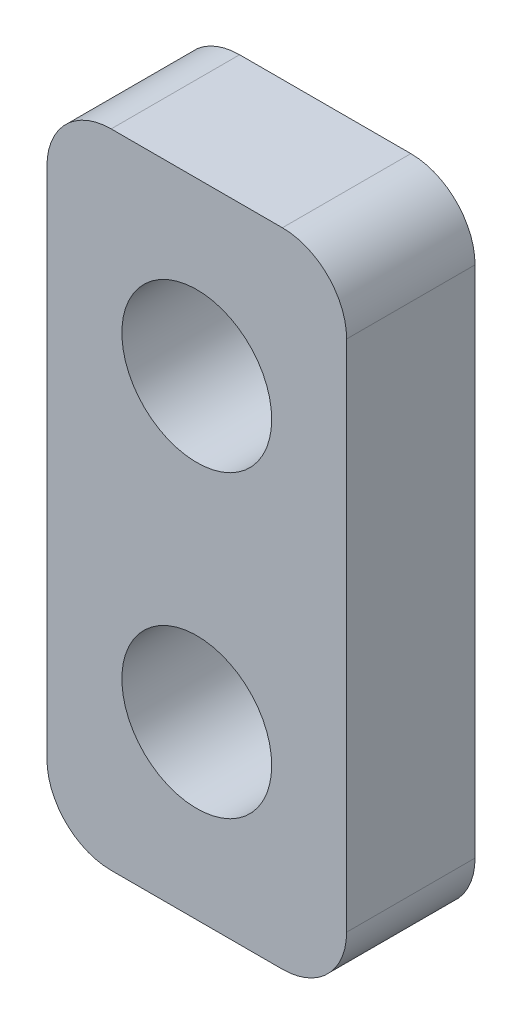
ISO-10303-21;
HEADER;
FILE_DESCRIPTION(('STEP AP214'),'2;1');
FILE_NAME('part.step','',(''),(''),'','','');
FILE_SCHEMA(('AUTOMOTIVE_DESIGN { 1 0 10303 214 1 1 1 1 }'));
ENDSEC;
DATA;
#1=APPLICATION_CONTEXT('core data for automotive mechanical design processes');
#2=APPLICATION_PROTOCOL_DEFINITION('international standard','automotive_design',2000,#1);
#3=PRODUCT_CONTEXT('',#1,'mechanical');
#4=PRODUCT('Part','Part','',(#3));
#5=PRODUCT_RELATED_PRODUCT_CATEGORY('part','',(#4));
#6=PRODUCT_DEFINITION_FORMATION('','',#4);
#7=PRODUCT_DEFINITION_CONTEXT('part definition',#1,'design');
#8=PRODUCT_DEFINITION('design','',#6,#7);
#9=PRODUCT_DEFINITION_SHAPE('','',#8);
#10=(LENGTH_UNIT() NAMED_UNIT(*) SI_UNIT(.MILLI.,.METRE.));
#11=(NAMED_UNIT(*) PLANE_ANGLE_UNIT() SI_UNIT($,.RADIAN.));
#12=(NAMED_UNIT(*) SI_UNIT($,.STERADIAN.) SOLID_ANGLE_UNIT());
#13=UNCERTAINTY_MEASURE_WITH_UNIT(LENGTH_MEASURE(1.E-05),#10,'distance_accuracy_value','');
#14=(GEOMETRIC_REPRESENTATION_CONTEXT(3) GLOBAL_UNCERTAINTY_ASSIGNED_CONTEXT((#13)) GLOBAL_UNIT_ASSIGNED_CONTEXT((#10,
#11,#12)) REPRESENTATION_CONTEXT('',''));
#15=CARTESIAN_POINT('',(0.,0.,0.));
#16=DIRECTION('',(0.,0.,1.));
#17=DIRECTION('',(1.,0.,0.));
#18=AXIS2_PLACEMENT_3D('',#15,#16,#17);
#19=CARTESIAN_POINT('',(3.,3.,6.));
#20=DIRECTION('',(0.,0.,-1.));
#21=DIRECTION('',(-1.,0.,0.));
#22=AXIS2_PLACEMENT_3D('',#19,#20,#21);
#23=PLANE('',#22);
#24=CARTESIAN_POINT('',(3.,3.,6.));
#25=DIRECTION('',(0.,0.,1.));
#26=DIRECTION('',(-1.,0.,0.));
#27=AXIS2_PLACEMENT_3D('',#24,#25,#26);
#28=CIRCLE('',#27,3.);
#29=CARTESIAN_POINT('',(0.,3.00000000000002,6.));
#30=VERTEX_POINT('',#29);
#31=CARTESIAN_POINT('',(3.00000000000002,0.,6.));
#32=VERTEX_POINT('',#31);
#33=EDGE_CURVE('E164',#30,#32,#28,.T.);
#34=ORIENTED_EDGE('',*,*,#33,.T.);
#35=DIRECTION('',(1.,0.,0.));
#36=VECTOR('',#35,1.);
#37=CARTESIAN_POINT('',(3.00000000000002,0.,6.));
#38=LINE('',#37,#36);
#39=CARTESIAN_POINT('',(11.,0.,6.));
#40=VERTEX_POINT('',#39);
#41=EDGE_CURVE('E100',#32,#40,#38,.T.);
#42=ORIENTED_EDGE('',*,*,#41,.T.);
#43=CARTESIAN_POINT('',(11.,3.,6.));
#44=DIRECTION('',(0.,0.,1.));
#45=DIRECTION('',(1.,0.,0.));
#46=AXIS2_PLACEMENT_3D('',#43,#44,#45);
#47=CIRCLE('',#46,3.);
#48=CARTESIAN_POINT('',(14.,3.,6.));
#49=VERTEX_POINT('',#48);
#50=EDGE_CURVE('E185',#40,#49,#47,.T.);
#51=ORIENTED_EDGE('',*,*,#50,.T.);
#52=DIRECTION('',(0.,1.,0.));
#53=VECTOR('',#52,1.);
#54=CARTESIAN_POINT('',(14.,3.00000000000002,6.));
#55=LINE('',#54,#53);
#56=CARTESIAN_POINT('',(14.,27.,6.));
#57=VERTEX_POINT('',#56);
#58=EDGE_CURVE('E199',#49,#57,#55,.T.);
#59=ORIENTED_EDGE('',*,*,#58,.T.);
#60=CARTESIAN_POINT('',(11.,27.,6.));
#61=DIRECTION('',(0.,0.,1.));
#62=DIRECTION('',(-1.,0.,0.));
#63=AXIS2_PLACEMENT_3D('',#60,#61,#62);
#64=CIRCLE('',#63,3.);
#65=CARTESIAN_POINT('',(11.,30.,6.));
#66=VERTEX_POINT('',#65);
#67=EDGE_CURVE('E119',#57,#66,#64,.T.);
#68=ORIENTED_EDGE('',*,*,#67,.T.);
#69=DIRECTION('',(-1.,0.,0.));
#70=VECTOR('',#69,1.);
#71=CARTESIAN_POINT('',(3.00000000000002,30.,6.));
#72=LINE('',#71,#70);
#73=CARTESIAN_POINT('',(3.00000000000002,30.,6.));
#74=VERTEX_POINT('',#73);
#75=EDGE_CURVE('E113',#66,#74,#72,.T.);
#76=ORIENTED_EDGE('',*,*,#75,.T.);
#77=CARTESIAN_POINT('',(3.,27.,6.));
#78=DIRECTION('',(0.,0.,1.));
#79=DIRECTION('',(-1.,0.,0.));
#80=AXIS2_PLACEMENT_3D('',#77,#78,#79);
#81=CIRCLE('',#80,3.);
#82=CARTESIAN_POINT('',(0.,27.,6.));
#83=VERTEX_POINT('',#82);
#84=EDGE_CURVE('E117',#74,#83,#81,.T.);
#85=ORIENTED_EDGE('',*,*,#84,.T.);
#86=DIRECTION('',(0.,-1.,0.));
#87=VECTOR('',#86,1.);
#88=CARTESIAN_POINT('',(0.,3.00000000000002,6.));
#89=LINE('',#88,#87);
#90=EDGE_CURVE('E57',#83,#30,#89,.T.);
#91=ORIENTED_EDGE('',*,*,#90,.T.);
#92=EDGE_LOOP('',(#34,#42,#51,#59,#68,#76,#85,#91));
#93=FACE_BOUND('',#92,.T.);
#94=CARTESIAN_POINT('',(7.,22.,6.));
#95=DIRECTION('',(0.,0.,1.));
#96=DIRECTION('',(1.,0.,0.));
#97=AXIS2_PLACEMENT_3D('',#94,#95,#96);
#98=CIRCLE('',#97,3.5);
#99=CARTESIAN_POINT('',(10.5,22.,6.));
#100=VERTEX_POINT('',#99);
#101=EDGE_CURVE('E146',#100,#100,#98,.T.);
#102=ORIENTED_EDGE('',*,*,#101,.F.);
#103=EDGE_LOOP('',(#102));
#104=FACE_BOUND('',#103,.T.);
#105=CARTESIAN_POINT('',(7.,8.,6.));
#106=DIRECTION('',(0.,0.,1.));
#107=DIRECTION('',(1.,0.,0.));
#108=AXIS2_PLACEMENT_3D('',#105,#106,#107);
#109=CIRCLE('',#108,3.5);
#110=CARTESIAN_POINT('',(10.5,8.,6.));
#111=VERTEX_POINT('',#110);
#112=EDGE_CURVE('E213',#111,#111,#109,.T.);
#113=ORIENTED_EDGE('',*,*,#112,.F.);
#114=EDGE_LOOP('',(#113));
#115=FACE_BOUND('',#114,.T.);
#116=ADVANCED_FACE('F39',(#93,#104,#115),#23,.F.);
#117=CARTESIAN_POINT('',(3.,3.,0.));
#118=DIRECTION('',(0.,0.,-1.));
#119=DIRECTION('',(-1.,0.,0.));
#120=AXIS2_PLACEMENT_3D('',#117,#118,#119);
#121=PLANE('',#120);
#122=CARTESIAN_POINT('',(7.,22.,0.));
#123=DIRECTION('',(0.,0.,1.));
#124=DIRECTION('',(1.,0.,0.));
#125=AXIS2_PLACEMENT_3D('',#122,#123,#124);
#126=CIRCLE('',#125,3.5);
#127=CARTESIAN_POINT('',(10.5,22.,0.));
#128=VERTEX_POINT('',#127);
#129=EDGE_CURVE('E209',#128,#128,#126,.T.);
#130=ORIENTED_EDGE('',*,*,#129,.T.);
#131=EDGE_LOOP('',(#130));
#132=FACE_BOUND('',#131,.T.);
#133=CARTESIAN_POINT('',(3.,3.,0.));
#134=DIRECTION('',(0.,0.,1.));
#135=DIRECTION('',(-1.,0.,0.));
#136=AXIS2_PLACEMENT_3D('',#133,#134,#135);
#137=CIRCLE('',#136,3.);
#138=CARTESIAN_POINT('',(0.,3.00000000000002,0.));
#139=VERTEX_POINT('',#138);
#140=CARTESIAN_POINT('',(3.00000000000002,0.,0.));
#141=VERTEX_POINT('',#140);
#142=EDGE_CURVE('E141',#139,#141,#137,.T.);
#143=ORIENTED_EDGE('',*,*,#142,.F.);
#144=DIRECTION('',(0.,-1.,0.));
#145=VECTOR('',#144,1.);
#146=CARTESIAN_POINT('',(0.,3.00000000000002,0.));
#147=LINE('',#146,#145);
#148=CARTESIAN_POINT('',(0.,27.,0.));
#149=VERTEX_POINT('',#148);
#150=EDGE_CURVE('E92',#149,#139,#147,.T.);
#151=ORIENTED_EDGE('',*,*,#150,.F.);
#152=CARTESIAN_POINT('',(3.,27.,0.));
#153=DIRECTION('',(0.,0.,1.));
#154=DIRECTION('',(-1.,0.,0.));
#155=AXIS2_PLACEMENT_3D('',#152,#153,#154);
#156=CIRCLE('',#155,3.);
#157=CARTESIAN_POINT('',(3.00000000000002,30.,0.));
#158=VERTEX_POINT('',#157);
#159=EDGE_CURVE('E86',#158,#149,#156,.T.);
#160=ORIENTED_EDGE('',*,*,#159,.F.);
#161=DIRECTION('',(-1.,0.,0.));
#162=VECTOR('',#161,1.);
#163=CARTESIAN_POINT('',(3.00000000000002,30.,0.));
#164=LINE('',#163,#162);
#165=CARTESIAN_POINT('',(11.,30.,0.));
#166=VERTEX_POINT('',#165);
#167=EDGE_CURVE('E128',#166,#158,#164,.T.);
#168=ORIENTED_EDGE('',*,*,#167,.F.);
#169=CARTESIAN_POINT('',(11.,27.,0.));
#170=DIRECTION('',(0.,0.,1.));
#171=DIRECTION('',(-1.,0.,0.));
#172=AXIS2_PLACEMENT_3D('',#169,#170,#171);
#173=CIRCLE('',#172,3.);
#174=CARTESIAN_POINT('',(14.,27.,0.));
#175=VERTEX_POINT('',#174);
#176=EDGE_CURVE('E155',#175,#166,#173,.T.);
#177=ORIENTED_EDGE('',*,*,#176,.F.);
#178=DIRECTION('',(0.,1.,0.));
#179=VECTOR('',#178,1.);
#180=CARTESIAN_POINT('',(14.,3.00000000000002,0.));
#181=LINE('',#180,#179);
#182=CARTESIAN_POINT('',(14.,3.,0.));
#183=VERTEX_POINT('',#182);
#184=EDGE_CURVE('E152',#183,#175,#181,.T.);
#185=ORIENTED_EDGE('',*,*,#184,.F.);
#186=CARTESIAN_POINT('',(11.,3.,0.));
#187=DIRECTION('',(0.,0.,1.));
#188=DIRECTION('',(1.,0.,0.));
#189=AXIS2_PLACEMENT_3D('',#186,#187,#188);
#190=CIRCLE('',#189,3.);
#191=CARTESIAN_POINT('',(11.,0.,0.));
#192=VERTEX_POINT('',#191);
#193=EDGE_CURVE('E149',#192,#183,#190,.T.);
#194=ORIENTED_EDGE('',*,*,#193,.F.);
#195=DIRECTION('',(1.,0.,0.));
#196=VECTOR('',#195,1.);
#197=CARTESIAN_POINT('',(3.00000000000002,0.,0.));
#198=LINE('',#197,#196);
#199=EDGE_CURVE('E145',#141,#192,#198,.T.);
#200=ORIENTED_EDGE('',*,*,#199,.F.);
#201=EDGE_LOOP('',(#143,#151,#160,#168,#177,#185,#194,#200));
#202=FACE_BOUND('',#201,.T.);
#203=CARTESIAN_POINT('',(7.,8.,0.));
#204=DIRECTION('',(0.,0.,1.));
#205=DIRECTION('',(1.,0.,0.));
#206=AXIS2_PLACEMENT_3D('',#203,#204,#205);
#207=CIRCLE('',#206,3.5);
#208=CARTESIAN_POINT('',(10.5,8.,0.));
#209=VERTEX_POINT('',#208);
#210=EDGE_CURVE('E217',#209,#209,#207,.T.);
#211=ORIENTED_EDGE('',*,*,#210,.T.);
#212=EDGE_LOOP('',(#211));
#213=FACE_BOUND('',#212,.T.);
#214=ADVANCED_FACE('F189',(#132,#202,#213),#121,.T.);
#215=CARTESIAN_POINT('',(3.,3.,6.));
#216=DIRECTION('',(0.,0.,-1.));
#217=DIRECTION('',(-1.,0.,0.));
#218=AXIS2_PLACEMENT_3D('',#215,#216,#217);
#219=CYLINDRICAL_SURFACE('',#218,3.);
#220=ORIENTED_EDGE('',*,*,#142,.T.);
#221=DIRECTION('',(0.,0.,-1.));
#222=VECTOR('',#221,1.);
#223=CARTESIAN_POINT('',(3.00000000000002,0.,6.));
#224=LINE('',#223,#222);
#225=EDGE_CURVE('E11',#32,#141,#224,.T.);
#226=ORIENTED_EDGE('',*,*,#225,.F.);
#227=ORIENTED_EDGE('',*,*,#33,.F.);
#228=DIRECTION('',(0.,0.,-1.));
#229=VECTOR('',#228,1.);
#230=CARTESIAN_POINT('',(0.,3.00000000000002,6.));
#231=LINE('',#230,#229);
#232=EDGE_CURVE('E137',#30,#139,#231,.T.);
#233=ORIENTED_EDGE('',*,*,#232,.T.);
#234=EDGE_LOOP('',(#220,#226,#227,#233));
#235=FACE_BOUND('',#234,.T.);
#236=ADVANCED_FACE('F41',(#235),#219,.T.);
#237=CARTESIAN_POINT('',(3.00000000000002,0.,6.));
#238=DIRECTION('',(0.,1.,0.));
#239=DIRECTION('',(0.,0.,1.));
#240=AXIS2_PLACEMENT_3D('',#237,#238,#239);
#241=PLANE('',#240);
#242=ORIENTED_EDGE('',*,*,#199,.T.);
#243=DIRECTION('',(0.,0.,-1.));
#244=VECTOR('',#243,1.);
#245=CARTESIAN_POINT('',(11.,0.,6.));
#246=LINE('',#245,#244);
#247=EDGE_CURVE('E49',#40,#192,#246,.T.);
#248=ORIENTED_EDGE('',*,*,#247,.F.);
#249=ORIENTED_EDGE('',*,*,#41,.F.);
#250=ORIENTED_EDGE('',*,*,#225,.T.);
#251=EDGE_LOOP('',(#242,#248,#249,#250));
#252=FACE_BOUND('',#251,.T.);
#253=ADVANCED_FACE('F251',(#252),#241,.F.);
#254=CARTESIAN_POINT('',(11.,3.,6.));
#255=DIRECTION('',(0.,0.,-1.));
#256=DIRECTION('',(-1.,0.,0.));
#257=AXIS2_PLACEMENT_3D('',#254,#255,#256);
#258=CYLINDRICAL_SURFACE('',#257,3.);
#259=ORIENTED_EDGE('',*,*,#193,.T.);
#260=DIRECTION('',(0.,0.,-1.));
#261=VECTOR('',#260,1.);
#262=CARTESIAN_POINT('',(14.,3.,6.));
#263=LINE('',#262,#261);
#264=EDGE_CURVE('E175',#49,#183,#263,.T.);
#265=ORIENTED_EDGE('',*,*,#264,.F.);
#266=ORIENTED_EDGE('',*,*,#50,.F.);
#267=ORIENTED_EDGE('',*,*,#247,.T.);
#268=EDGE_LOOP('',(#259,#265,#266,#267));
#269=FACE_BOUND('',#268,.T.);
#270=ADVANCED_FACE('F183',(#269),#258,.T.);
#271=CARTESIAN_POINT('',(14.,3.00000000000002,6.));
#272=DIRECTION('',(-1.,0.,0.));
#273=DIRECTION('',(0.,0.,1.));
#274=AXIS2_PLACEMENT_3D('',#271,#272,#273);
#275=PLANE('',#274);
#276=ORIENTED_EDGE('',*,*,#184,.T.);
#277=DIRECTION('',(0.,0.,-1.));
#278=VECTOR('',#277,1.);
#279=CARTESIAN_POINT('',(14.,27.,6.));
#280=LINE('',#279,#278);
#281=EDGE_CURVE('E171',#57,#175,#280,.T.);
#282=ORIENTED_EDGE('',*,*,#281,.F.);
#283=ORIENTED_EDGE('',*,*,#58,.F.);
#284=ORIENTED_EDGE('',*,*,#264,.T.);
#285=EDGE_LOOP('',(#276,#282,#283,#284));
#286=FACE_BOUND('',#285,.T.);
#287=ADVANCED_FACE('F194',(#286),#275,.F.);
#288=CARTESIAN_POINT('',(11.,27.,6.));
#289=DIRECTION('',(0.,0.,-1.));
#290=DIRECTION('',(-1.,0.,0.));
#291=AXIS2_PLACEMENT_3D('',#288,#289,#290);
#292=CYLINDRICAL_SURFACE('',#291,3.);
#293=ORIENTED_EDGE('',*,*,#176,.T.);
#294=DIRECTION('',(0.,0.,-1.));
#295=VECTOR('',#294,1.);
#296=CARTESIAN_POINT('',(11.,30.,6.));
#297=LINE('',#296,#295);
#298=EDGE_CURVE('E130',#66,#166,#297,.T.);
#299=ORIENTED_EDGE('',*,*,#298,.F.);
#300=ORIENTED_EDGE('',*,*,#67,.F.);
#301=ORIENTED_EDGE('',*,*,#281,.T.);
#302=EDGE_LOOP('',(#293,#299,#300,#301));
#303=FACE_BOUND('',#302,.T.);
#304=ADVANCED_FACE('F197',(#303),#292,.T.);
#305=CARTESIAN_POINT('',(3.00000000000002,30.,6.));
#306=DIRECTION('',(0.,-1.,0.));
#307=DIRECTION('',(0.,0.,-1.));
#308=AXIS2_PLACEMENT_3D('',#305,#306,#307);
#309=PLANE('',#308);
#310=ORIENTED_EDGE('',*,*,#167,.T.);
#311=DIRECTION('',(0.,0.,-1.));
#312=VECTOR('',#311,1.);
#313=CARTESIAN_POINT('',(3.00000000000002,30.,6.));
#314=LINE('',#313,#312);
#315=EDGE_CURVE('E125',#74,#158,#314,.T.);
#316=ORIENTED_EDGE('',*,*,#315,.F.);
#317=ORIENTED_EDGE('',*,*,#75,.F.);
#318=ORIENTED_EDGE('',*,*,#298,.T.);
#319=EDGE_LOOP('',(#310,#316,#317,#318));
#320=FACE_BOUND('',#319,.T.);
#321=ADVANCED_FACE('F126',(#320),#309,.F.);
#322=CARTESIAN_POINT('',(3.,27.,6.));
#323=DIRECTION('',(0.,0.,-1.));
#324=DIRECTION('',(-1.,0.,0.));
#325=AXIS2_PLACEMENT_3D('',#322,#323,#324);
#326=CYLINDRICAL_SURFACE('',#325,3.);
#327=ORIENTED_EDGE('',*,*,#159,.T.);
#328=DIRECTION('',(0.,0.,-1.));
#329=VECTOR('',#328,1.);
#330=CARTESIAN_POINT('',(0.,27.,6.));
#331=LINE('',#330,#329);
#332=EDGE_CURVE('E131',#83,#149,#331,.T.);
#333=ORIENTED_EDGE('',*,*,#332,.F.);
#334=ORIENTED_EDGE('',*,*,#84,.F.);
#335=ORIENTED_EDGE('',*,*,#315,.T.);
#336=EDGE_LOOP('',(#327,#333,#334,#335));
#337=FACE_BOUND('',#336,.T.);
#338=ADVANCED_FACE('F133',(#337),#326,.T.);
#339=CARTESIAN_POINT('',(0.,3.00000000000002,6.));
#340=DIRECTION('',(1.,0.,0.));
#341=DIRECTION('',(0.,0.,-1.));
#342=AXIS2_PLACEMENT_3D('',#339,#340,#341);
#343=PLANE('',#342);
#344=ORIENTED_EDGE('',*,*,#150,.T.);
#345=ORIENTED_EDGE('',*,*,#232,.F.);
#346=ORIENTED_EDGE('',*,*,#90,.F.);
#347=ORIENTED_EDGE('',*,*,#332,.T.);
#348=EDGE_LOOP('',(#344,#345,#346,#347));
#349=FACE_BOUND('',#348,.T.);
#350=ADVANCED_FACE('F239',(#349),#343,.F.);
#351=CARTESIAN_POINT('',(7.,22.,6.));
#352=DIRECTION('',(0.,0.,-1.));
#353=DIRECTION('',(-1.,0.,0.));
#354=AXIS2_PLACEMENT_3D('',#351,#352,#353);
#355=CYLINDRICAL_SURFACE('',#354,3.5);
#356=ORIENTED_EDGE('',*,*,#101,.T.);
#357=EDGE_LOOP('',(#356));
#358=FACE_BOUND('',#357,.T.);
#359=ORIENTED_EDGE('',*,*,#129,.F.);
#360=EDGE_LOOP('',(#359));
#361=FACE_BOUND('',#360,.T.);
#362=ADVANCED_FACE('F236',(#358,#361),#355,.F.);
#363=CARTESIAN_POINT('',(7.,8.,6.));
#364=DIRECTION('',(0.,0.,-1.));
#365=DIRECTION('',(-1.,0.,0.));
#366=AXIS2_PLACEMENT_3D('',#363,#364,#365);
#367=CYLINDRICAL_SURFACE('',#366,3.5);
#368=ORIENTED_EDGE('',*,*,#112,.T.);
#369=EDGE_LOOP('',(#368));
#370=FACE_BOUND('',#369,.T.);
#371=ORIENTED_EDGE('',*,*,#210,.F.);
#372=EDGE_LOOP('',(#371));
#373=FACE_BOUND('',#372,.T.);
#374=ADVANCED_FACE('F225',(#370,#373),#367,.F.);
#375=CLOSED_SHELL('',(#116,#214,#236,#253,#270,#287,#304,#321,#338,#350,#362,#374));
#376=MANIFOLD_SOLID_BREP('B2',#375);
#377=ADVANCED_BREP_SHAPE_REPRESENTATION('',(#18,#376),#14);
#378=SHAPE_DEFINITION_REPRESENTATION(#9,#377);
ENDSEC;
END-ISO-10303-21;
